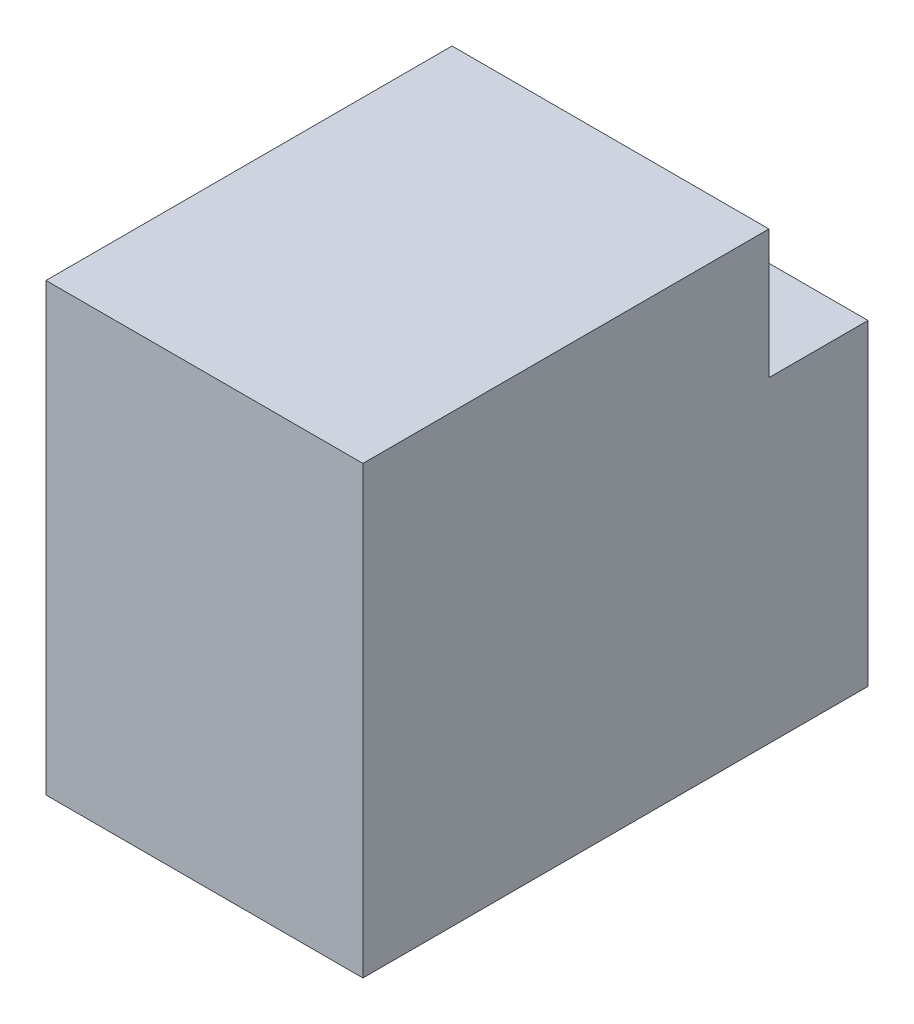
ISO-10303-21;
HEADER;
FILE_DESCRIPTION(('STEP AP214'),'2;1');
FILE_NAME('part.step','',(''),(''),'','','');
FILE_SCHEMA(('AUTOMOTIVE_DESIGN { 1 0 10303 214 1 1 1 1 }'));
ENDSEC;
DATA;
#1=APPLICATION_CONTEXT('core data for automotive mechanical design processes');
#2=APPLICATION_PROTOCOL_DEFINITION('international standard','automotive_design',2000,#1);
#3=PRODUCT_CONTEXT('',#1,'mechanical');
#4=PRODUCT('Part','Part','',(#3));
#5=PRODUCT_RELATED_PRODUCT_CATEGORY('part','',(#4));
#6=PRODUCT_DEFINITION_FORMATION('','',#4);
#7=PRODUCT_DEFINITION_CONTEXT('part definition',#1,'design');
#8=PRODUCT_DEFINITION('design','',#6,#7);
#9=PRODUCT_DEFINITION_SHAPE('','',#8);
#10=(LENGTH_UNIT() NAMED_UNIT(*) SI_UNIT(.MILLI.,.METRE.));
#11=(NAMED_UNIT(*) PLANE_ANGLE_UNIT() SI_UNIT($,.RADIAN.));
#12=(NAMED_UNIT(*) SI_UNIT($,.STERADIAN.) SOLID_ANGLE_UNIT());
#13=UNCERTAINTY_MEASURE_WITH_UNIT(LENGTH_MEASURE(1.E-05),#10,'distance_accuracy_value','');
#14=(GEOMETRIC_REPRESENTATION_CONTEXT(3) GLOBAL_UNCERTAINTY_ASSIGNED_CONTEXT((#13)) GLOBAL_UNIT_ASSIGNED_CONTEXT((#10,
#11,#12)) REPRESENTATION_CONTEXT('',''));
#15=CARTESIAN_POINT('',(0.,0.,0.));
#16=DIRECTION('',(0.,0.,1.));
#17=DIRECTION('',(1.,0.,0.));
#18=AXIS2_PLACEMENT_3D('',#15,#16,#17);
#19=CARTESIAN_POINT('',(-16.,16.,10.));
#20=DIRECTION('',(1.,0.,0.));
#21=DIRECTION('',(0.,1.,0.));
#22=AXIS2_PLACEMENT_3D('',#19,#20,#21);
#23=PLANE('',#22);
#24=DIRECTION('',(0.,-1.,0.));
#25=VECTOR('',#24,1.);
#26=CARTESIAN_POINT('',(-16.,16.,0.));
#27=LINE('',#26,#25);
#28=CARTESIAN_POINT('',(-16.,16.,0.));
#29=VERTEX_POINT('',#28);
#30=CARTESIAN_POINT('',(-16.,-16.,0.));
#31=VERTEX_POINT('',#30);
#32=EDGE_CURVE('E94',#29,#31,#27,.T.);
#33=ORIENTED_EDGE('',*,*,#32,.T.);
#34=DIRECTION('',(0.,0.,-1.));
#35=VECTOR('',#34,1.);
#36=CARTESIAN_POINT('',(-16.,-16.,10.));
#37=LINE('',#36,#35);
#38=CARTESIAN_POINT('',(-16.,-16.,51.));
#39=VERTEX_POINT('',#38);
#40=EDGE_CURVE('E11',#39,#31,#37,.T.);
#41=ORIENTED_EDGE('',*,*,#40,.F.);
#42=DIRECTION('',(0.,-1.,0.));
#43=VECTOR('',#42,1.);
#44=CARTESIAN_POINT('',(-16.,-16.,51.));
#45=LINE('',#44,#43);
#46=CARTESIAN_POINT('',(-16.,29.,51.));
#47=VERTEX_POINT('',#46);
#48=EDGE_CURVE('E117',#47,#39,#45,.T.);
#49=ORIENTED_EDGE('',*,*,#48,.F.);
#50=DIRECTION('',(0.,0.,-1.));
#51=VECTOR('',#50,1.);
#52=CARTESIAN_POINT('',(-16.,29.,51.));
#53=LINE('',#52,#51);
#54=CARTESIAN_POINT('',(-16.,29.,10.));
#55=VERTEX_POINT('',#54);
#56=EDGE_CURVE('E123',#47,#55,#53,.T.);
#57=ORIENTED_EDGE('',*,*,#56,.T.);
#58=DIRECTION('',(0.,-1.,0.));
#59=VECTOR('',#58,1.);
#60=CARTESIAN_POINT('',(-16.,-16.,10.));
#61=LINE('',#60,#59);
#62=CARTESIAN_POINT('',(-16.,16.,10.));
#63=VERTEX_POINT('',#62);
#64=EDGE_CURVE('E104',#55,#63,#61,.T.);
#65=ORIENTED_EDGE('',*,*,#64,.T.);
#66=DIRECTION('',(0.,0.,-1.));
#67=VECTOR('',#66,1.);
#68=CARTESIAN_POINT('',(-16.,16.,10.));
#69=LINE('',#68,#67);
#70=EDGE_CURVE('E89',#63,#29,#69,.T.);
#71=ORIENTED_EDGE('',*,*,#70,.T.);
#72=EDGE_LOOP('',(#33,#41,#49,#57,#65,#71));
#73=FACE_BOUND('',#72,.T.);
#74=ADVANCED_FACE('F43',(#73),#23,.F.);
#75=CARTESIAN_POINT('',(16.,-16.,10.));
#76=DIRECTION('',(0.,1.,0.));
#77=DIRECTION('',(-1.,0.,0.));
#78=AXIS2_PLACEMENT_3D('',#75,#76,#77);
#79=PLANE('',#78);
#80=DIRECTION('',(1.,0.,0.));
#81=VECTOR('',#80,1.);
#82=CARTESIAN_POINT('',(16.,-16.,0.));
#83=LINE('',#82,#81);
#84=CARTESIAN_POINT('',(16.,-16.,0.));
#85=VERTEX_POINT('',#84);
#86=EDGE_CURVE('E80',#31,#85,#83,.T.);
#87=ORIENTED_EDGE('',*,*,#86,.T.);
#88=DIRECTION('',(0.,0.,-1.));
#89=VECTOR('',#88,1.);
#90=CARTESIAN_POINT('',(16.,-16.,10.));
#91=LINE('',#90,#89);
#92=CARTESIAN_POINT('',(16.,-16.,51.));
#93=VERTEX_POINT('',#92);
#94=EDGE_CURVE('E51',#93,#85,#91,.T.);
#95=ORIENTED_EDGE('',*,*,#94,.F.);
#96=DIRECTION('',(1.,0.,0.));
#97=VECTOR('',#96,1.);
#98=CARTESIAN_POINT('',(-16.,-16.,51.));
#99=LINE('',#98,#97);
#100=EDGE_CURVE('E134',#39,#93,#99,.T.);
#101=ORIENTED_EDGE('',*,*,#100,.F.);
#102=ORIENTED_EDGE('',*,*,#40,.T.);
#103=EDGE_LOOP('',(#87,#95,#101,#102));
#104=FACE_BOUND('',#103,.T.);
#105=ADVANCED_FACE('F129',(#104),#79,.F.);
#106=CARTESIAN_POINT('',(16.,16.,10.));
#107=DIRECTION('',(-1.,0.,0.));
#108=DIRECTION('',(0.,-1.,0.));
#109=AXIS2_PLACEMENT_3D('',#106,#107,#108);
#110=PLANE('',#109);
#111=DIRECTION('',(0.,1.,0.));
#112=VECTOR('',#111,1.);
#113=CARTESIAN_POINT('',(16.,16.,0.));
#114=LINE('',#113,#112);
#115=CARTESIAN_POINT('',(16.,16.,0.));
#116=VERTEX_POINT('',#115);
#117=EDGE_CURVE('E73',#85,#116,#114,.T.);
#118=ORIENTED_EDGE('',*,*,#117,.T.);
#119=DIRECTION('',(0.,0.,-1.));
#120=VECTOR('',#119,1.);
#121=CARTESIAN_POINT('',(16.,16.,10.));
#122=LINE('',#121,#120);
#123=CARTESIAN_POINT('',(16.,16.,10.));
#124=VERTEX_POINT('',#123);
#125=EDGE_CURVE('E58',#124,#116,#122,.T.);
#126=ORIENTED_EDGE('',*,*,#125,.F.);
#127=DIRECTION('',(0.,1.,0.));
#128=VECTOR('',#127,1.);
#129=CARTESIAN_POINT('',(16.,-16.,10.));
#130=LINE('',#129,#128);
#131=CARTESIAN_POINT('',(16.,29.,10.));
#132=VERTEX_POINT('',#131);
#133=EDGE_CURVE('E110',#124,#132,#130,.T.);
#134=ORIENTED_EDGE('',*,*,#133,.T.);
#135=DIRECTION('',(0.,0.,-1.));
#136=VECTOR('',#135,1.);
#137=CARTESIAN_POINT('',(16.,29.,51.));
#138=LINE('',#137,#136);
#139=CARTESIAN_POINT('',(16.,29.,51.));
#140=VERTEX_POINT('',#139);
#141=EDGE_CURVE('E125',#140,#132,#138,.T.);
#142=ORIENTED_EDGE('',*,*,#141,.F.);
#143=DIRECTION('',(0.,1.,0.));
#144=VECTOR('',#143,1.);
#145=CARTESIAN_POINT('',(16.,-16.,51.));
#146=LINE('',#145,#144);
#147=EDGE_CURVE('E149',#93,#140,#146,.T.);
#148=ORIENTED_EDGE('',*,*,#147,.F.);
#149=ORIENTED_EDGE('',*,*,#94,.T.);
#150=EDGE_LOOP('',(#118,#126,#134,#142,#148,#149));
#151=FACE_BOUND('',#150,.T.);
#152=ADVANCED_FACE('F74',(#151),#110,.F.);
#153=CARTESIAN_POINT('',(16.,16.,10.));
#154=DIRECTION('',(0.,-1.,0.));
#155=DIRECTION('',(1.,0.,0.));
#156=AXIS2_PLACEMENT_3D('',#153,#154,#155);
#157=PLANE('',#156);
#158=DIRECTION('',(-1.,0.,0.));
#159=VECTOR('',#158,1.);
#160=CARTESIAN_POINT('',(16.,16.,0.));
#161=LINE('',#160,#159);
#162=EDGE_CURVE('E79',#116,#29,#161,.T.);
#163=ORIENTED_EDGE('',*,*,#162,.T.);
#164=ORIENTED_EDGE('',*,*,#70,.F.);
#165=DIRECTION('',(-1.,0.,0.));
#166=VECTOR('',#165,1.);
#167=CARTESIAN_POINT('',(16.,16.,10.));
#168=LINE('',#167,#166);
#169=EDGE_CURVE('E87',#124,#63,#168,.T.);
#170=ORIENTED_EDGE('',*,*,#169,.F.);
#171=ORIENTED_EDGE('',*,*,#125,.T.);
#172=EDGE_LOOP('',(#163,#164,#170,#171));
#173=FACE_BOUND('',#172,.T.);
#174=ADVANCED_FACE('F83',(#173),#157,.F.);
#175=CARTESIAN_POINT('',(0.,0.,0.));
#176=DIRECTION('',(0.,0.,-1.));
#177=DIRECTION('',(-1.,0.,0.));
#178=AXIS2_PLACEMENT_3D('',#175,#176,#177);
#179=PLANE('',#178);
#180=CARTESIAN_POINT('',(12.,-12.,0.));
#181=DIRECTION('',(0.,0.,-1.));
#182=DIRECTION('',(-1.,0.,0.));
#183=AXIS2_PLACEMENT_3D('',#180,#181,#182);
#184=CIRCLE('',#183,1.6);
#185=CARTESIAN_POINT('',(10.4,-12.,0.));
#186=VERTEX_POINT('',#185);
#187=EDGE_CURVE('E159',#186,#186,#184,.T.);
#188=ORIENTED_EDGE('',*,*,#187,.F.);
#189=EDGE_LOOP('',(#188));
#190=FACE_BOUND('',#189,.T.);
#191=CARTESIAN_POINT('',(-12.,12.,0.));
#192=DIRECTION('',(0.,0.,-1.));
#193=DIRECTION('',(-1.,0.,0.));
#194=AXIS2_PLACEMENT_3D('',#191,#192,#193);
#195=CIRCLE('',#194,1.6);
#196=CARTESIAN_POINT('',(-13.6,12.,0.));
#197=VERTEX_POINT('',#196);
#198=EDGE_CURVE('E165',#197,#197,#195,.T.);
#199=ORIENTED_EDGE('',*,*,#198,.F.);
#200=EDGE_LOOP('',(#199));
#201=FACE_BOUND('',#200,.T.);
#202=CARTESIAN_POINT('',(-12.,-12.,0.));
#203=DIRECTION('',(0.,0.,-1.));
#204=DIRECTION('',(-1.,0.,0.));
#205=AXIS2_PLACEMENT_3D('',#202,#203,#204);
#206=CIRCLE('',#205,1.6);
#207=CARTESIAN_POINT('',(-13.6,-12.,0.));
#208=VERTEX_POINT('',#207);
#209=EDGE_CURVE('E166',#208,#208,#206,.T.);
#210=ORIENTED_EDGE('',*,*,#209,.F.);
#211=EDGE_LOOP('',(#210));
#212=FACE_BOUND('',#211,.T.);
#213=CARTESIAN_POINT('',(0.,0.,0.));
#214=DIRECTION('',(0.,0.,-1.));
#215=DIRECTION('',(-1.,0.,0.));
#216=AXIS2_PLACEMENT_3D('',#213,#214,#215);
#217=CIRCLE('',#216,6.5);
#218=CARTESIAN_POINT('',(-6.50000000000001,0.,0.));
#219=VERTEX_POINT('',#218);
#220=EDGE_CURVE('E177',#219,#219,#217,.T.);
#221=ORIENTED_EDGE('',*,*,#220,.F.);
#222=EDGE_LOOP('',(#221));
#223=FACE_BOUND('',#222,.T.);
#224=CARTESIAN_POINT('',(12.,12.,0.));
#225=DIRECTION('',(0.,0.,-1.));
#226=DIRECTION('',(-1.,0.,0.));
#227=AXIS2_PLACEMENT_3D('',#224,#225,#226);
#228=CIRCLE('',#227,1.6);
#229=CARTESIAN_POINT('',(10.4,12.,0.));
#230=VERTEX_POINT('',#229);
#231=EDGE_CURVE('E156',#230,#230,#228,.T.);
#232=ORIENTED_EDGE('',*,*,#231,.F.);
#233=EDGE_LOOP('',(#232));
#234=FACE_BOUND('',#233,.T.);
#235=ORIENTED_EDGE('',*,*,#32,.F.);
#236=ORIENTED_EDGE('',*,*,#162,.F.);
#237=ORIENTED_EDGE('',*,*,#117,.F.);
#238=ORIENTED_EDGE('',*,*,#86,.F.);
#239=EDGE_LOOP('',(#235,#236,#237,#238));
#240=FACE_BOUND('',#239,.T.);
#241=ADVANCED_FACE('F92',(#190,#201,#212,#223,#234,#240),#179,.T.);
#242=CARTESIAN_POINT('',(-16.,29.,51.));
#243=DIRECTION('',(0.,-1.,0.));
#244=DIRECTION('',(0.,0.,-1.));
#245=AXIS2_PLACEMENT_3D('',#242,#243,#244);
#246=PLANE('',#245);
#247=DIRECTION('',(-1.,0.,0.));
#248=VECTOR('',#247,1.);
#249=CARTESIAN_POINT('',(-16.,29.,10.));
#250=LINE('',#249,#248);
#251=EDGE_CURVE('E113',#132,#55,#250,.T.);
#252=ORIENTED_EDGE('',*,*,#251,.T.);
#253=ORIENTED_EDGE('',*,*,#56,.F.);
#254=DIRECTION('',(-1.,0.,0.));
#255=VECTOR('',#254,1.);
#256=CARTESIAN_POINT('',(-16.,29.,51.));
#257=LINE('',#256,#255);
#258=EDGE_CURVE('E126',#140,#47,#257,.T.);
#259=ORIENTED_EDGE('',*,*,#258,.F.);
#260=ORIENTED_EDGE('',*,*,#141,.T.);
#261=EDGE_LOOP('',(#252,#253,#259,#260));
#262=FACE_BOUND('',#261,.T.);
#263=ADVANCED_FACE('F151',(#262),#246,.F.);
#264=CARTESIAN_POINT('',(0.,0.,51.));
#265=DIRECTION('',(0.,0.,-1.));
#266=DIRECTION('',(-1.,0.,0.));
#267=AXIS2_PLACEMENT_3D('',#264,#265,#266);
#268=PLANE('',#267);
#269=ORIENTED_EDGE('',*,*,#48,.T.);
#270=ORIENTED_EDGE('',*,*,#100,.T.);
#271=ORIENTED_EDGE('',*,*,#147,.T.);
#272=ORIENTED_EDGE('',*,*,#258,.T.);
#273=EDGE_LOOP('',(#269,#270,#271,#272));
#274=FACE_BOUND('',#273,.T.);
#275=ADVANCED_FACE('F148',(#274),#268,.F.);
#276=CARTESIAN_POINT('',(0.,0.,10.));
#277=DIRECTION('',(0.,0.,-1.));
#278=DIRECTION('',(-1.,0.,0.));
#279=AXIS2_PLACEMENT_3D('',#276,#277,#278);
#280=PLANE('',#279);
#281=ORIENTED_EDGE('',*,*,#133,.F.);
#282=ORIENTED_EDGE('',*,*,#169,.T.);
#283=ORIENTED_EDGE('',*,*,#64,.F.);
#284=ORIENTED_EDGE('',*,*,#251,.F.);
#285=EDGE_LOOP('',(#281,#282,#283,#284));
#286=FACE_BOUND('',#285,.T.);
#287=ADVANCED_FACE('F107',(#286),#280,.T.);
#288=CARTESIAN_POINT('',(12.,12.,10.));
#289=DIRECTION('',(0.,0.,-1.));
#290=DIRECTION('',(-1.,0.,0.));
#291=AXIS2_PLACEMENT_3D('',#288,#289,#290);
#292=CYLINDRICAL_SURFACE('',#291,1.6);
#293=CARTESIAN_POINT('',(12.,12.,10.));
#294=DIRECTION('',(0.,0.,-1.));
#295=DIRECTION('',(-1.,0.,0.));
#296=AXIS2_PLACEMENT_3D('',#293,#294,#295);
#297=CIRCLE('',#296,1.6);
#298=CARTESIAN_POINT('',(10.4,12.,10.));
#299=VERTEX_POINT('',#298);
#300=EDGE_CURVE('E119',#299,#299,#297,.T.);
#301=ORIENTED_EDGE('',*,*,#300,.F.);
#302=EDGE_LOOP('',(#301));
#303=FACE_BOUND('',#302,.T.);
#304=ORIENTED_EDGE('',*,*,#231,.T.);
#305=EDGE_LOOP('',(#304));
#306=FACE_BOUND('',#305,.T.);
#307=ADVANCED_FACE('F196',(#303,#306),#292,.F.);
#308=CARTESIAN_POINT('',(12.,12.,10.));
#309=DIRECTION('',(0.,0.,-1.));
#310=DIRECTION('',(-1.,0.,0.));
#311=AXIS2_PLACEMENT_3D('',#308,#309,#310);
#312=PLANE('',#311);
#313=ORIENTED_EDGE('',*,*,#300,.T.);
#314=EDGE_LOOP('',(#313));
#315=FACE_BOUND('',#314,.T.);
#316=ADVANCED_FACE('F198',(#315),#312,.T.);
#317=CARTESIAN_POINT('',(0.,0.,10.));
#318=DIRECTION('',(0.,0.,-1.));
#319=DIRECTION('',(-1.,0.,0.));
#320=AXIS2_PLACEMENT_3D('',#317,#318,#319);
#321=CYLINDRICAL_SURFACE('',#320,6.5);
#322=CARTESIAN_POINT('',(0.,0.,10.));
#323=DIRECTION('',(0.,0.,-1.));
#324=DIRECTION('',(-1.,0.,0.));
#325=AXIS2_PLACEMENT_3D('',#322,#323,#324);
#326=CIRCLE('',#325,6.5);
#327=CARTESIAN_POINT('',(-6.50000000000001,0.,10.));
#328=VERTEX_POINT('',#327);
#329=EDGE_CURVE('E174',#328,#328,#326,.T.);
#330=ORIENTED_EDGE('',*,*,#329,.F.);
#331=EDGE_LOOP('',(#330));
#332=FACE_BOUND('',#331,.T.);
#333=ORIENTED_EDGE('',*,*,#220,.T.);
#334=EDGE_LOOP('',(#333));
#335=FACE_BOUND('',#334,.T.);
#336=ADVANCED_FACE('F204',(#332,#335),#321,.F.);
#337=CARTESIAN_POINT('',(0.,0.,10.));
#338=DIRECTION('',(0.,0.,-1.));
#339=DIRECTION('',(-1.,0.,0.));
#340=AXIS2_PLACEMENT_3D('',#337,#338,#339);
#341=PLANE('',#340);
#342=ORIENTED_EDGE('',*,*,#329,.T.);
#343=EDGE_LOOP('',(#342));
#344=FACE_BOUND('',#343,.T.);
#345=ADVANCED_FACE('F286',(#344),#341,.T.);
#346=CARTESIAN_POINT('',(-12.,-12.,10.));
#347=DIRECTION('',(0.,0.,-1.));
#348=DIRECTION('',(-1.,0.,0.));
#349=AXIS2_PLACEMENT_3D('',#346,#347,#348);
#350=CYLINDRICAL_SURFACE('',#349,1.6);
#351=CARTESIAN_POINT('',(-12.,-12.,10.));
#352=DIRECTION('',(0.,0.,-1.));
#353=DIRECTION('',(-1.,0.,0.));
#354=AXIS2_PLACEMENT_3D('',#351,#352,#353);
#355=CIRCLE('',#354,1.6);
#356=CARTESIAN_POINT('',(-13.6,-12.,10.));
#357=VERTEX_POINT('',#356);
#358=EDGE_CURVE('E180',#357,#357,#355,.T.);
#359=ORIENTED_EDGE('',*,*,#358,.F.);
#360=EDGE_LOOP('',(#359));
#361=FACE_BOUND('',#360,.T.);
#362=ORIENTED_EDGE('',*,*,#209,.T.);
#363=EDGE_LOOP('',(#362));
#364=FACE_BOUND('',#363,.T.);
#365=ADVANCED_FACE('F186',(#361,#364),#350,.F.);
#366=CARTESIAN_POINT('',(-12.,-12.,10.));
#367=DIRECTION('',(0.,0.,-1.));
#368=DIRECTION('',(-1.,0.,0.));
#369=AXIS2_PLACEMENT_3D('',#366,#367,#368);
#370=PLANE('',#369);
#371=ORIENTED_EDGE('',*,*,#358,.T.);
#372=EDGE_LOOP('',(#371));
#373=FACE_BOUND('',#372,.T.);
#374=ADVANCED_FACE('F303',(#373),#370,.T.);
#375=CARTESIAN_POINT('',(-12.,12.,10.));
#376=DIRECTION('',(0.,0.,-1.));
#377=DIRECTION('',(-1.,0.,0.));
#378=AXIS2_PLACEMENT_3D('',#375,#376,#377);
#379=CYLINDRICAL_SURFACE('',#378,1.6);
#380=CARTESIAN_POINT('',(-12.,12.,10.));
#381=DIRECTION('',(0.,0.,-1.));
#382=DIRECTION('',(-1.,0.,0.));
#383=AXIS2_PLACEMENT_3D('',#380,#381,#382);
#384=CIRCLE('',#383,1.6);
#385=CARTESIAN_POINT('',(-13.6,12.,10.));
#386=VERTEX_POINT('',#385);
#387=EDGE_CURVE('E162',#386,#386,#384,.T.);
#388=ORIENTED_EDGE('',*,*,#387,.F.);
#389=EDGE_LOOP('',(#388));
#390=FACE_BOUND('',#389,.T.);
#391=ORIENTED_EDGE('',*,*,#198,.T.);
#392=EDGE_LOOP('',(#391));
#393=FACE_BOUND('',#392,.T.);
#394=ADVANCED_FACE('F312',(#390,#393),#379,.F.);
#395=CARTESIAN_POINT('',(-12.,12.,10.));
#396=DIRECTION('',(0.,0.,-1.));
#397=DIRECTION('',(-1.,0.,0.));
#398=AXIS2_PLACEMENT_3D('',#395,#396,#397);
#399=PLANE('',#398);
#400=ORIENTED_EDGE('',*,*,#387,.T.);
#401=EDGE_LOOP('',(#400));
#402=FACE_BOUND('',#401,.T.);
#403=ADVANCED_FACE('F321',(#402),#399,.T.);
#404=CARTESIAN_POINT('',(12.,-12.,10.));
#405=DIRECTION('',(0.,0.,-1.));
#406=DIRECTION('',(-1.,0.,0.));
#407=AXIS2_PLACEMENT_3D('',#404,#405,#406);
#408=CYLINDRICAL_SURFACE('',#407,1.6);
#409=CARTESIAN_POINT('',(12.,-12.,10.));
#410=DIRECTION('',(0.,0.,-1.));
#411=DIRECTION('',(-1.,0.,0.));
#412=AXIS2_PLACEMENT_3D('',#409,#410,#411);
#413=CIRCLE('',#412,1.6);
#414=CARTESIAN_POINT('',(10.4,-12.,10.));
#415=VERTEX_POINT('',#414);
#416=EDGE_CURVE('E169',#415,#415,#413,.T.);
#417=ORIENTED_EDGE('',*,*,#416,.F.);
#418=EDGE_LOOP('',(#417));
#419=FACE_BOUND('',#418,.T.);
#420=ORIENTED_EDGE('',*,*,#187,.T.);
#421=EDGE_LOOP('',(#420));
#422=FACE_BOUND('',#421,.T.);
#423=ADVANCED_FACE('F330',(#419,#422),#408,.F.);
#424=CARTESIAN_POINT('',(12.,-12.,10.));
#425=DIRECTION('',(0.,0.,-1.));
#426=DIRECTION('',(-1.,0.,0.));
#427=AXIS2_PLACEMENT_3D('',#424,#425,#426);
#428=PLANE('',#427);
#429=ORIENTED_EDGE('',*,*,#416,.T.);
#430=EDGE_LOOP('',(#429));
#431=FACE_BOUND('',#430,.T.);
#432=ADVANCED_FACE('F339',(#431),#428,.T.);
#433=CLOSED_SHELL('',(#74,#105,#152,#174,#241,#263,#275,#287,#307,#316,#336,#345,#365,#374,#394,
#403,#423,#432));
#434=MANIFOLD_SOLID_BREP('B2',#433);
#435=ADVANCED_BREP_SHAPE_REPRESENTATION('',(#18,#434),#14);
#436=SHAPE_DEFINITION_REPRESENTATION(#9,#435);
ENDSEC;
END-ISO-10303-21;
